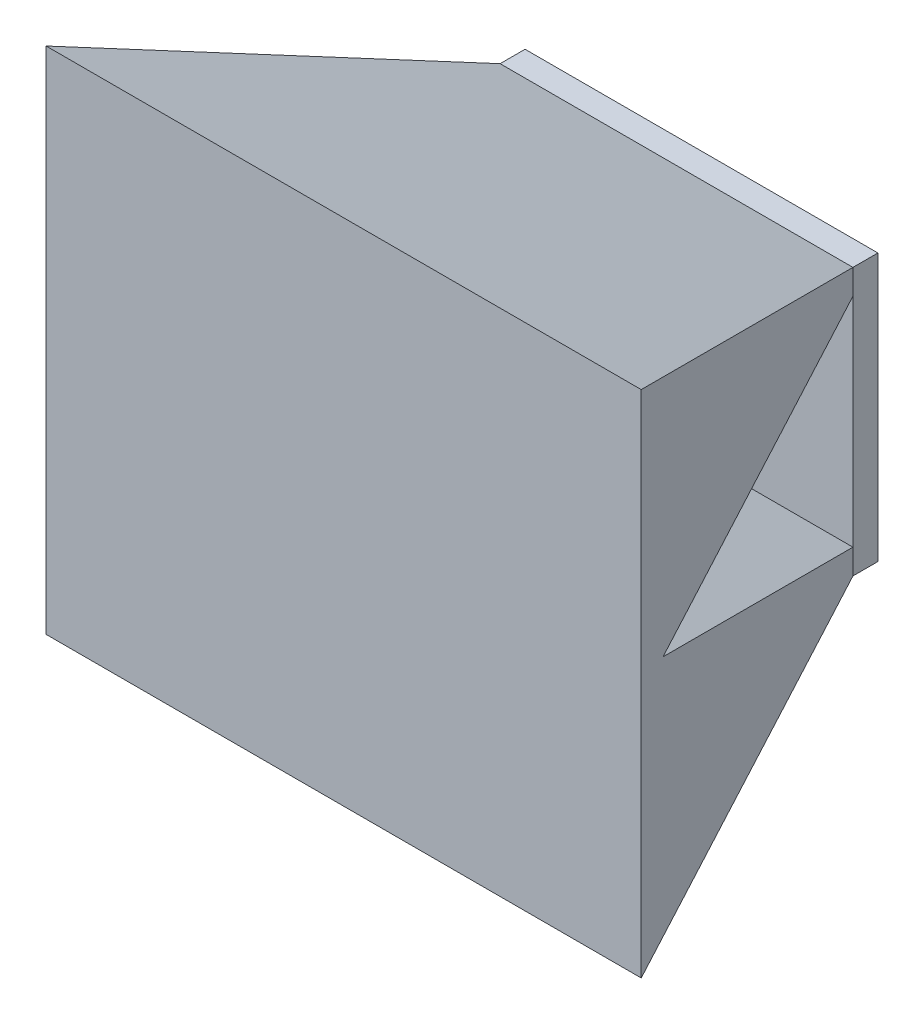
ISO-10303-21;
HEADER;
FILE_DESCRIPTION(('STEP AP214'),'2;1');
FILE_NAME('part.step','',(''),(''),'','','');
FILE_SCHEMA(('AUTOMOTIVE_DESIGN { 1 0 10303 214 1 1 1 1 }'));
ENDSEC;
DATA;
#1=APPLICATION_CONTEXT('core data for automotive mechanical design processes');
#2=APPLICATION_PROTOCOL_DEFINITION('international standard','automotive_design',2000,#1);
#3=PRODUCT_CONTEXT('',#1,'mechanical');
#4=PRODUCT('Part','Part','',(#3));
#5=PRODUCT_RELATED_PRODUCT_CATEGORY('part','',(#4));
#6=PRODUCT_DEFINITION_FORMATION('','',#4);
#7=PRODUCT_DEFINITION_CONTEXT('part definition',#1,'design');
#8=PRODUCT_DEFINITION('design','',#6,#7);
#9=PRODUCT_DEFINITION_SHAPE('','',#8);
#10=(LENGTH_UNIT() NAMED_UNIT(*) SI_UNIT(.MILLI.,.METRE.));
#11=(NAMED_UNIT(*) PLANE_ANGLE_UNIT() SI_UNIT($,.RADIAN.));
#12=(NAMED_UNIT(*) SI_UNIT($,.STERADIAN.) SOLID_ANGLE_UNIT());
#13=UNCERTAINTY_MEASURE_WITH_UNIT(LENGTH_MEASURE(1.E-05),#10,'distance_accuracy_value','');
#14=(GEOMETRIC_REPRESENTATION_CONTEXT(3) GLOBAL_UNCERTAINTY_ASSIGNED_CONTEXT((#13)) GLOBAL_UNIT_ASSIGNED_CONTEXT((#10,
#11,#12)) REPRESENTATION_CONTEXT('',''));
#15=CARTESIAN_POINT('',(0.,0.,0.));
#16=DIRECTION('',(0.,0.,1.));
#17=DIRECTION('',(1.,0.,0.));
#18=AXIS2_PLACEMENT_3D('',#15,#16,#17);
#19=CARTESIAN_POINT('',(0.,0.,3.));
#20=DIRECTION('',(0.,0.,-1.));
#21=DIRECTION('',(-1.,0.,0.));
#22=AXIS2_PLACEMENT_3D('',#19,#20,#21);
#23=PLANE('',#22);
#24=DIRECTION('',(0.,-1.,0.));
#25=VECTOR('',#24,1.);
#26=CARTESIAN_POINT('',(-21.2,-16.06,3.));
#27=LINE('',#26,#25);
#28=CARTESIAN_POINT('',(-21.2,13.06,3.));
#29=VERTEX_POINT('',#28);
#30=CARTESIAN_POINT('',(-21.2,-13.06,3.));
#31=VERTEX_POINT('',#30);
#32=EDGE_CURVE('E220',#29,#31,#27,.T.);
#33=ORIENTED_EDGE('',*,*,#32,.T.);
#34=DIRECTION('',(1.,0.,0.));
#35=VECTOR('',#34,1.);
#36=CARTESIAN_POINT('',(-21.2,-13.06,3.));
#37=LINE('',#36,#35);
#38=CARTESIAN_POINT('',(-1.5,-13.06,3.));
#39=VERTEX_POINT('',#38);
#40=EDGE_CURVE('E54',#31,#39,#37,.T.);
#41=ORIENTED_EDGE('',*,*,#40,.T.);
#42=DIRECTION('',(0.,1.,0.));
#43=VECTOR('',#42,1.);
#44=CARTESIAN_POINT('',(-1.5,0.,3.));
#45=LINE('',#44,#43);
#46=CARTESIAN_POINT('',(-1.5,13.06,3.));
#47=VERTEX_POINT('',#46);
#48=EDGE_CURVE('E58',#39,#47,#45,.T.);
#49=ORIENTED_EDGE('',*,*,#48,.T.);
#50=DIRECTION('',(1.,0.,0.));
#51=VECTOR('',#50,1.);
#52=CARTESIAN_POINT('',(0.,13.06,3.));
#53=LINE('',#52,#51);
#54=EDGE_CURVE('E147',#29,#47,#53,.T.);
#55=ORIENTED_EDGE('',*,*,#54,.F.);
#56=EDGE_LOOP('',(#33,#41,#49,#55));
#57=FACE_BOUND('',#56,.T.);
#58=ADVANCED_FACE('F37',(#57),#23,.F.);
#59=CARTESIAN_POINT('',(21.2,-16.06,3.));
#60=DIRECTION('',(-1.,0.,0.));
#61=DIRECTION('',(0.,0.,1.));
#62=AXIS2_PLACEMENT_3D('',#59,#60,#61);
#63=PLANE('',#62);
#64=DIRECTION('',(0.,1.,0.));
#65=VECTOR('',#64,1.);
#66=CARTESIAN_POINT('',(21.2,-16.06,0.));
#67=LINE('',#66,#65);
#68=CARTESIAN_POINT('',(21.2,-16.06,0.));
#69=VERTEX_POINT('',#68);
#70=CARTESIAN_POINT('',(21.2,16.06,0.));
#71=VERTEX_POINT('',#70);
#72=EDGE_CURVE('E215',#69,#71,#67,.T.);
#73=ORIENTED_EDGE('',*,*,#72,.T.);
#74=DIRECTION('',(0.,0.,-1.));
#75=VECTOR('',#74,1.);
#76=CARTESIAN_POINT('',(21.2,16.06,3.));
#77=LINE('',#76,#75);
#78=CARTESIAN_POINT('',(21.2,16.06,3.));
#79=VERTEX_POINT('',#78);
#80=EDGE_CURVE('E11',#79,#71,#77,.T.);
#81=ORIENTED_EDGE('',*,*,#80,.F.);
#82=DIRECTION('',(0.,1.,0.));
#83=VECTOR('',#82,1.);
#84=CARTESIAN_POINT('',(21.2,0.,3.));
#85=LINE('',#84,#83);
#86=CARTESIAN_POINT('',(21.2,13.06,3.));
#87=VERTEX_POINT('',#86);
#88=EDGE_CURVE('E145',#87,#79,#85,.T.);
#89=ORIENTED_EDGE('',*,*,#88,.F.);
#90=DIRECTION('',(0.,1.,0.));
#91=VECTOR('',#90,1.);
#92=CARTESIAN_POINT('',(21.2,-16.06,3.));
#93=LINE('',#92,#91);
#94=CARTESIAN_POINT('',(21.2,-13.06,3.));
#95=VERTEX_POINT('',#94);
#96=EDGE_CURVE('E126',#95,#87,#93,.T.);
#97=ORIENTED_EDGE('',*,*,#96,.F.);
#98=CARTESIAN_POINT('',(21.2,-16.06,3.));
#99=VERTEX_POINT('',#98);
#100=EDGE_CURVE('E137',#99,#95,#93,.T.);
#101=ORIENTED_EDGE('',*,*,#100,.F.);
#102=DIRECTION('',(0.,0.,-1.));
#103=VECTOR('',#102,1.);
#104=CARTESIAN_POINT('',(21.2,-16.06,3.));
#105=LINE('',#104,#103);
#106=EDGE_CURVE('E221',#99,#69,#105,.T.);
#107=ORIENTED_EDGE('',*,*,#106,.T.);
#108=EDGE_LOOP('',(#73,#81,#89,#97,#101,#107));
#109=FACE_BOUND('',#108,.T.);
#110=ADVANCED_FACE('F45',(#109),#63,.F.);
#111=CARTESIAN_POINT('',(-21.2,16.06,3.));
#112=DIRECTION('',(0.,-1.,0.));
#113=DIRECTION('',(0.,0.,-1.));
#114=AXIS2_PLACEMENT_3D('',#111,#112,#113);
#115=PLANE('',#114);
#116=DIRECTION('',(-1.,0.,0.));
#117=VECTOR('',#116,1.);
#118=CARTESIAN_POINT('',(-21.2,16.06,0.));
#119=LINE('',#118,#117);
#120=CARTESIAN_POINT('',(-21.2,16.06,0.));
#121=VERTEX_POINT('',#120);
#122=EDGE_CURVE('E226',#71,#121,#119,.T.);
#123=ORIENTED_EDGE('',*,*,#122,.T.);
#124=DIRECTION('',(0.,0.,-1.));
#125=VECTOR('',#124,1.);
#126=CARTESIAN_POINT('',(-21.2,16.06,3.));
#127=LINE('',#126,#125);
#128=CARTESIAN_POINT('',(-21.2,16.06,3.));
#129=VERTEX_POINT('',#128);
#130=EDGE_CURVE('E48',#129,#121,#127,.T.);
#131=ORIENTED_EDGE('',*,*,#130,.F.);
#132=DIRECTION('',(-1.,0.,0.));
#133=VECTOR('',#132,1.);
#134=CARTESIAN_POINT('',(-21.2,16.06,3.));
#135=LINE('',#134,#133);
#136=EDGE_CURVE('E212',#79,#129,#135,.T.);
#137=ORIENTED_EDGE('',*,*,#136,.F.);
#138=ORIENTED_EDGE('',*,*,#80,.T.);
#139=EDGE_LOOP('',(#123,#131,#137,#138));
#140=FACE_BOUND('',#139,.T.);
#141=ADVANCED_FACE('F269',(#140),#115,.F.);
#142=CARTESIAN_POINT('',(-21.2,-16.06,3.));
#143=DIRECTION('',(1.,0.,0.));
#144=DIRECTION('',(0.,0.,-1.));
#145=AXIS2_PLACEMENT_3D('',#142,#143,#144);
#146=PLANE('',#145);
#147=DIRECTION('',(0.,-1.,0.));
#148=VECTOR('',#147,1.);
#149=CARTESIAN_POINT('',(-21.2,-16.06,0.));
#150=LINE('',#149,#148);
#151=CARTESIAN_POINT('',(-21.2,-16.06,0.));
#152=VERTEX_POINT('',#151);
#153=EDGE_CURVE('E227',#121,#152,#150,.T.);
#154=ORIENTED_EDGE('',*,*,#153,.T.);
#155=DIRECTION('',(0.,0.,-1.));
#156=VECTOR('',#155,1.);
#157=CARTESIAN_POINT('',(-21.2,-16.06,3.));
#158=LINE('',#157,#156);
#159=CARTESIAN_POINT('',(-21.2,-16.06,3.));
#160=VERTEX_POINT('',#159);
#161=EDGE_CURVE('E234',#160,#152,#158,.T.);
#162=ORIENTED_EDGE('',*,*,#161,.F.);
#163=DIRECTION('',(0.,1.,0.));
#164=VECTOR('',#163,1.);
#165=CARTESIAN_POINT('',(-21.2,-16.06,3.));
#166=LINE('',#165,#164);
#167=EDGE_CURVE('E189',#160,#31,#166,.T.);
#168=ORIENTED_EDGE('',*,*,#167,.T.);
#169=ORIENTED_EDGE('',*,*,#32,.F.);
#170=EDGE_CURVE('E217',#129,#29,#27,.T.);
#171=ORIENTED_EDGE('',*,*,#170,.F.);
#172=ORIENTED_EDGE('',*,*,#130,.T.);
#173=EDGE_LOOP('',(#154,#162,#168,#169,#171,#172));
#174=FACE_BOUND('',#173,.T.);
#175=ADVANCED_FACE('F239',(#174),#146,.F.);
#176=CARTESIAN_POINT('',(-21.2,-16.06,3.));
#177=DIRECTION('',(0.,1.,0.));
#178=DIRECTION('',(-1.,0.,0.));
#179=AXIS2_PLACEMENT_3D('',#176,#177,#178);
#180=PLANE('',#179);
#181=DIRECTION('',(1.,0.,0.));
#182=VECTOR('',#181,1.);
#183=CARTESIAN_POINT('',(-21.2,-16.06,0.));
#184=LINE('',#183,#182);
#185=EDGE_CURVE('E139',#152,#69,#184,.T.);
#186=ORIENTED_EDGE('',*,*,#185,.T.);
#187=ORIENTED_EDGE('',*,*,#106,.F.);
#188=DIRECTION('',(1.,0.,0.));
#189=VECTOR('',#188,1.);
#190=CARTESIAN_POINT('',(-21.2,-16.06,3.));
#191=LINE('',#190,#189);
#192=EDGE_CURVE('E222',#160,#99,#191,.T.);
#193=ORIENTED_EDGE('',*,*,#192,.F.);
#194=ORIENTED_EDGE('',*,*,#161,.T.);
#195=EDGE_LOOP('',(#186,#187,#193,#194));
#196=FACE_BOUND('',#195,.T.);
#197=ADVANCED_FACE('F250',(#196),#180,.F.);
#198=DIRECTION('',(0.,1.,0.));
#199=VECTOR('',#198,1.);
#200=CARTESIAN_POINT('',(1.5,0.,3.));
#201=LINE('',#200,#199);
#202=CARTESIAN_POINT('',(1.5,-13.06,3.));
#203=VERTEX_POINT('',#202);
#204=CARTESIAN_POINT('',(1.5,13.06,3.));
#205=VERTEX_POINT('',#204);
#206=EDGE_CURVE('E164',#203,#205,#201,.T.);
#207=ORIENTED_EDGE('',*,*,#206,.F.);
#208=EDGE_CURVE('E134',#203,#95,#37,.T.);
#209=ORIENTED_EDGE('',*,*,#208,.T.);
#210=ORIENTED_EDGE('',*,*,#96,.T.);
#211=DIRECTION('',(1.,0.,0.));
#212=VECTOR('',#211,1.);
#213=CARTESIAN_POINT('',(0.,13.06,3.));
#214=LINE('',#213,#212);
#215=EDGE_CURVE('E135',#205,#87,#214,.T.);
#216=ORIENTED_EDGE('',*,*,#215,.F.);
#217=EDGE_LOOP('',(#207,#209,#210,#216));
#218=FACE_BOUND('',#217,.T.);
#219=ADVANCED_FACE('F128',(#218),#23,.F.);
#220=CARTESIAN_POINT('',(0.,0.,0.));
#221=DIRECTION('',(0.,0.,-1.));
#222=DIRECTION('',(-1.,0.,0.));
#223=AXIS2_PLACEMENT_3D('',#220,#221,#222);
#224=PLANE('',#223);
#225=ORIENTED_EDGE('',*,*,#72,.F.);
#226=ORIENTED_EDGE('',*,*,#185,.F.);
#227=ORIENTED_EDGE('',*,*,#153,.F.);
#228=ORIENTED_EDGE('',*,*,#122,.F.);
#229=EDGE_LOOP('',(#225,#226,#227,#228));
#230=FACE_BOUND('',#229,.T.);
#231=ADVANCED_FACE('F244',(#230),#224,.T.);
#232=CARTESIAN_POINT('',(1.5,0.,3.));
#233=DIRECTION('',(0.939692620785908,0.,-0.342020143325669));
#234=DIRECTION('',(-0.342020143325669,0.,-0.939692620785908));
#235=AXIS2_PLACEMENT_3D('',#232,#233,#234);
#236=PLANE('',#235);
#237=DIRECTION('',(-0.323615577118185,0.323615577118185,-0.889126490715988));
#238=VECTOR('',#237,1.);
#239=CARTESIAN_POINT('',(2.86773516530118,11.6922648346988,6.75782148245902));
#240=LINE('',#239,#238);
#241=CARTESIAN_POINT('',(14.56,0.,38.8820550980773));
#242=VERTEX_POINT('',#241);
#243=EDGE_CURVE('E157',#242,#205,#240,.T.);
#244=ORIENTED_EDGE('',*,*,#243,.F.);
#245=DIRECTION('',(0.323615577118185,0.323615577118185,0.889126490715988));
#246=VECTOR('',#245,1.);
#247=CARTESIAN_POINT('',(2.86773516530118,-11.6922648346988,6.75782148245902));
#248=LINE('',#247,#246);
#249=EDGE_CURVE('E209',#242,#203,#248,.F.);
#250=ORIENTED_EDGE('',*,*,#249,.T.);
#251=ORIENTED_EDGE('',*,*,#206,.T.);
#252=EDGE_LOOP('',(#244,#250,#251));
#253=FACE_BOUND('',#252,.T.);
#254=ADVANCED_FACE('F286',(#253),#236,.T.);
#255=CARTESIAN_POINT('',(0.,13.06,3.));
#256=DIRECTION('',(0.,-0.939692620785908,-0.342020143325669));
#257=DIRECTION('',(0.,0.342020143325669,-0.939692620785908));
#258=AXIS2_PLACEMENT_3D('',#255,#256,#257);
#259=PLANE('',#258);
#260=DIRECTION('',(-0.323615577118185,0.323615577118185,-0.889126490715988));
#261=VECTOR('',#260,1.);
#262=CARTESIAN_POINT('',(22.5677351653012,11.6922648346988,6.75782148245902));
#263=LINE('',#262,#261);
#264=CARTESIAN_POINT('',(34.26,0.,38.8820550980773));
#265=VERTEX_POINT('',#264);
#266=EDGE_CURVE('E152',#265,#87,#263,.T.);
#267=ORIENTED_EDGE('',*,*,#266,.F.);
#268=DIRECTION('',(1.,0.,0.));
#269=VECTOR('',#268,1.);
#270=CARTESIAN_POINT('',(0.,0.,38.8820550980773));
#271=LINE('',#270,#269);
#272=EDGE_CURVE('E208',#265,#242,#271,.F.);
#273=ORIENTED_EDGE('',*,*,#272,.T.);
#274=ORIENTED_EDGE('',*,*,#243,.T.);
#275=ORIENTED_EDGE('',*,*,#215,.T.);
#276=EDGE_LOOP('',(#267,#273,#274,#275));
#277=FACE_BOUND('',#276,.T.);
#278=ADVANCED_FACE('F165',(#277),#259,.T.);
#279=CARTESIAN_POINT('',(21.2,0.,3.));
#280=DIRECTION('',(0.939692620785908,0.,-0.342020143325669));
#281=DIRECTION('',(-0.342020143325669,0.,-0.939692620785908));
#282=AXIS2_PLACEMENT_3D('',#279,#280,#281);
#283=PLANE('',#282);
#284=DIRECTION('',(-0.323615577118185,-0.323615577118185,-0.889126490715988));
#285=VECTOR('',#284,1.);
#286=CARTESIAN_POINT('',(18.979786714825,13.839786714825,-3.09998586739137));
#287=LINE('',#286,#285);
#288=CARTESIAN_POINT('',(35.7588093706481,30.6188093706481,43.));
#289=VERTEX_POINT('',#288);
#290=EDGE_CURVE('E159',#289,#79,#287,.T.);
#291=ORIENTED_EDGE('',*,*,#290,.F.);
#292=DIRECTION('',(0.,-1.,0.));
#293=VECTOR('',#292,1.);
#294=CARTESIAN_POINT('',(35.7588093706481,0.,43.));
#295=LINE('',#294,#293);
#296=CARTESIAN_POINT('',(35.7588093706481,-30.6188093706481,43.));
#297=VERTEX_POINT('',#296);
#298=EDGE_CURVE('E172',#297,#289,#295,.F.);
#299=ORIENTED_EDGE('',*,*,#298,.F.);
#300=DIRECTION('',(-0.323615577118185,0.323615577118185,-0.889126490715988));
#301=VECTOR('',#300,1.);
#302=CARTESIAN_POINT('',(21.2,-16.06,3.));
#303=LINE('',#302,#301);
#304=EDGE_CURVE('E198',#297,#99,#303,.T.);
#305=ORIENTED_EDGE('',*,*,#304,.T.);
#306=ORIENTED_EDGE('',*,*,#100,.T.);
#307=DIRECTION('',(0.323615577118185,0.323615577118185,0.889126490715988));
#308=VECTOR('',#307,1.);
#309=CARTESIAN_POINT('',(20.8858188747394,-13.3741811252606,2.13679445272764));
#310=LINE('',#309,#308);
#311=EDGE_CURVE('E160',#265,#95,#310,.F.);
#312=ORIENTED_EDGE('',*,*,#311,.F.);
#313=ORIENTED_EDGE('',*,*,#266,.T.);
#314=ORIENTED_EDGE('',*,*,#88,.T.);
#315=EDGE_LOOP('',(#291,#299,#305,#306,#312,#313,#314));
#316=FACE_BOUND('',#315,.T.);
#317=ADVANCED_FACE('F154',(#316),#283,.T.);
#318=CARTESIAN_POINT('',(0.,16.06,3.));
#319=DIRECTION('',(0.,0.939692620785908,-0.342020143325669));
#320=DIRECTION('',(0.,-0.342020143325669,-0.939692620785908));
#321=AXIS2_PLACEMENT_3D('',#318,#319,#320);
#322=PLANE('',#321);
#323=ORIENTED_EDGE('',*,*,#136,.T.);
#324=DIRECTION('',(0.323615577118185,-0.323615577118185,-0.889126490715988));
#325=VECTOR('',#324,1.);
#326=CARTESIAN_POINT('',(-19.5180837094382,14.3780837094382,-1.62102702973139));
#327=LINE('',#326,#325);
#328=CARTESIAN_POINT('',(-35.7588093706481,30.6188093706481,43.));
#329=VERTEX_POINT('',#328);
#330=EDGE_CURVE('E178',#329,#129,#327,.T.);
#331=ORIENTED_EDGE('',*,*,#330,.F.);
#332=DIRECTION('',(1.,0.,0.));
#333=VECTOR('',#332,1.);
#334=CARTESIAN_POINT('',(0.,30.6188093706481,43.));
#335=LINE('',#334,#333);
#336=EDGE_CURVE('E190',#289,#329,#335,.F.);
#337=ORIENTED_EDGE('',*,*,#336,.F.);
#338=ORIENTED_EDGE('',*,*,#290,.T.);
#339=EDGE_LOOP('',(#323,#331,#337,#338));
#340=FACE_BOUND('',#339,.T.);
#341=ADVANCED_FACE('F267',(#340),#322,.T.);
#342=CARTESIAN_POINT('',(-21.2,0.,3.));
#343=DIRECTION('',(-0.939692620785908,0.,-0.342020143325669));
#344=DIRECTION('',(0.342020143325669,0.,-0.939692620785908));
#345=AXIS2_PLACEMENT_3D('',#342,#343,#344);
#346=PLANE('',#345);
#347=DIRECTION('',(0.323615577118185,0.323615577118185,-0.889126490715988));
#348=VECTOR('',#347,1.);
#349=CARTESIAN_POINT('',(-18.979786714825,15.280213285175,-3.09998586739137));
#350=LINE('',#349,#348);
#351=CARTESIAN_POINT('',(-34.26,0.,38.8820550980773));
#352=VERTEX_POINT('',#351);
#353=EDGE_CURVE('E177',#352,#29,#350,.T.);
#354=ORIENTED_EDGE('',*,*,#353,.F.);
#355=DIRECTION('',(0.323615577118185,-0.323615577118185,-0.889126490715988));
#356=VECTOR('',#355,1.);
#357=CARTESIAN_POINT('',(-20.8858188747394,-13.3741811252606,2.13679445272764));
#358=LINE('',#357,#356);
#359=EDGE_CURVE('E197',#352,#31,#358,.T.);
#360=ORIENTED_EDGE('',*,*,#359,.T.);
#361=ORIENTED_EDGE('',*,*,#167,.F.);
#362=DIRECTION('',(-0.323615577118185,-0.323615577118185,0.889126490715988));
#363=VECTOR('',#362,1.);
#364=CARTESIAN_POINT('',(-21.2,-16.06,3.));
#365=LINE('',#364,#363);
#366=CARTESIAN_POINT('',(-35.7588093706481,-30.6188093706481,43.));
#367=VERTEX_POINT('',#366);
#368=EDGE_CURVE('E170',#367,#160,#365,.F.);
#369=ORIENTED_EDGE('',*,*,#368,.F.);
#370=DIRECTION('',(0.,1.,0.));
#371=VECTOR('',#370,1.);
#372=CARTESIAN_POINT('',(-35.7588093706481,0.,43.));
#373=LINE('',#372,#371);
#374=EDGE_CURVE('E180',#329,#367,#373,.F.);
#375=ORIENTED_EDGE('',*,*,#374,.F.);
#376=ORIENTED_EDGE('',*,*,#330,.T.);
#377=ORIENTED_EDGE('',*,*,#170,.T.);
#378=EDGE_LOOP('',(#354,#360,#361,#369,#375,#376,#377));
#379=FACE_BOUND('',#378,.T.);
#380=ADVANCED_FACE('F265',(#379),#346,.T.);
#381=CARTESIAN_POINT('',(0.,13.06,3.));
#382=DIRECTION('',(0.,-0.939692620785908,-0.342020143325669));
#383=DIRECTION('',(0.,0.342020143325669,-0.939692620785908));
#384=AXIS2_PLACEMENT_3D('',#381,#382,#383);
#385=PLANE('',#384);
#386=DIRECTION('',(-0.323615577118185,-0.323615577118185,0.889126490715988));
#387=VECTOR('',#386,1.);
#388=CARTESIAN_POINT('',(-2.86773516530118,11.6922648346988,6.75782148245902));
#389=LINE('',#388,#387);
#390=CARTESIAN_POINT('',(-14.56,0.,38.8820550980773));
#391=VERTEX_POINT('',#390);
#392=EDGE_CURVE('E173',#391,#47,#389,.F.);
#393=ORIENTED_EDGE('',*,*,#392,.F.);
#394=DIRECTION('',(1.,0.,0.));
#395=VECTOR('',#394,1.);
#396=CARTESIAN_POINT('',(0.,0.,38.8820550980773));
#397=LINE('',#396,#395);
#398=EDGE_CURVE('E206',#391,#352,#397,.F.);
#399=ORIENTED_EDGE('',*,*,#398,.T.);
#400=ORIENTED_EDGE('',*,*,#353,.T.);
#401=ORIENTED_EDGE('',*,*,#54,.T.);
#402=EDGE_LOOP('',(#393,#399,#400,#401));
#403=FACE_BOUND('',#402,.T.);
#404=ADVANCED_FACE('F266',(#403),#385,.T.);
#405=CARTESIAN_POINT('',(-1.5,0.,3.));
#406=DIRECTION('',(-0.939692620785908,0.,-0.342020143325669));
#407=DIRECTION('',(0.342020143325669,0.,-0.939692620785908));
#408=AXIS2_PLACEMENT_3D('',#405,#406,#407);
#409=PLANE('',#408);
#410=DIRECTION('',(0.323615577118185,-0.323615577118185,-0.889126490715988));
#411=VECTOR('',#410,1.);
#412=CARTESIAN_POINT('',(-2.86773516530118,-11.6922648346988,6.75782148245902));
#413=LINE('',#412,#411);
#414=EDGE_CURVE('E183',#391,#39,#413,.T.);
#415=ORIENTED_EDGE('',*,*,#414,.F.);
#416=ORIENTED_EDGE('',*,*,#392,.T.);
#417=ORIENTED_EDGE('',*,*,#48,.F.);
#418=EDGE_LOOP('',(#415,#416,#417));
#419=FACE_BOUND('',#418,.T.);
#420=ADVANCED_FACE('F375',(#419),#409,.T.);
#421=CARTESIAN_POINT('',(0.,0.,43.));
#422=DIRECTION('',(0.,0.,1.));
#423=DIRECTION('',(1.,0.,0.));
#424=AXIS2_PLACEMENT_3D('',#421,#422,#423);
#425=PLANE('',#424);
#426=DIRECTION('',(-1.,0.,0.));
#427=VECTOR('',#426,1.);
#428=CARTESIAN_POINT('',(0.,-30.6188093706481,43.));
#429=LINE('',#428,#427);
#430=EDGE_CURVE('E193',#367,#297,#429,.F.);
#431=ORIENTED_EDGE('',*,*,#430,.T.);
#432=ORIENTED_EDGE('',*,*,#298,.T.);
#433=ORIENTED_EDGE('',*,*,#336,.T.);
#434=ORIENTED_EDGE('',*,*,#374,.T.);
#435=EDGE_LOOP('',(#431,#432,#433,#434));
#436=FACE_BOUND('',#435,.T.);
#437=ADVANCED_FACE('F260',(#436),#425,.T.);
#438=CARTESIAN_POINT('',(-21.2,-16.06,3.));
#439=DIRECTION('',(0.,-0.939692620785908,-0.342020143325669));
#440=DIRECTION('',(0.,0.342020143325669,-0.939692620785908));
#441=AXIS2_PLACEMENT_3D('',#438,#439,#440);
#442=PLANE('',#441);
#443=ORIENTED_EDGE('',*,*,#192,.T.);
#444=ORIENTED_EDGE('',*,*,#304,.F.);
#445=ORIENTED_EDGE('',*,*,#430,.F.);
#446=ORIENTED_EDGE('',*,*,#368,.T.);
#447=EDGE_LOOP('',(#443,#444,#445,#446));
#448=FACE_BOUND('',#447,.T.);
#449=ADVANCED_FACE('F253',(#448),#442,.T.);
#450=CARTESIAN_POINT('',(-21.2,-13.06,3.));
#451=DIRECTION('',(0.,0.939692620785908,-0.342020143325669));
#452=DIRECTION('',(0.,-0.342020143325669,-0.939692620785908));
#453=AXIS2_PLACEMENT_3D('',#450,#451,#452);
#454=PLANE('',#453);
#455=ORIENTED_EDGE('',*,*,#249,.F.);
#456=ORIENTED_EDGE('',*,*,#272,.F.);
#457=ORIENTED_EDGE('',*,*,#311,.T.);
#458=ORIENTED_EDGE('',*,*,#208,.F.);
#459=EDGE_LOOP('',(#455,#456,#457,#458));
#460=FACE_BOUND('',#459,.T.);
#461=ADVANCED_FACE('F400',(#460),#454,.T.);
#462=ORIENTED_EDGE('',*,*,#398,.F.);
#463=ORIENTED_EDGE('',*,*,#414,.T.);
#464=ORIENTED_EDGE('',*,*,#40,.F.);
#465=ORIENTED_EDGE('',*,*,#359,.F.);
#466=EDGE_LOOP('',(#462,#463,#464,#465));
#467=FACE_BOUND('',#466,.T.);
#468=ADVANCED_FACE('F335',(#467),#454,.T.);
#469=CLOSED_SHELL('',(#58,#110,#141,#175,#197,#219,#231,#254,#278,#317,#341,#380,#404,#420,#437,
#449,#461,#468));
#470=MANIFOLD_SOLID_BREP('B2',#469);
#471=ADVANCED_BREP_SHAPE_REPRESENTATION('',(#18,#470),#14);
#472=SHAPE_DEFINITION_REPRESENTATION(#9,#471);
ENDSEC;
END-ISO-10303-21;
